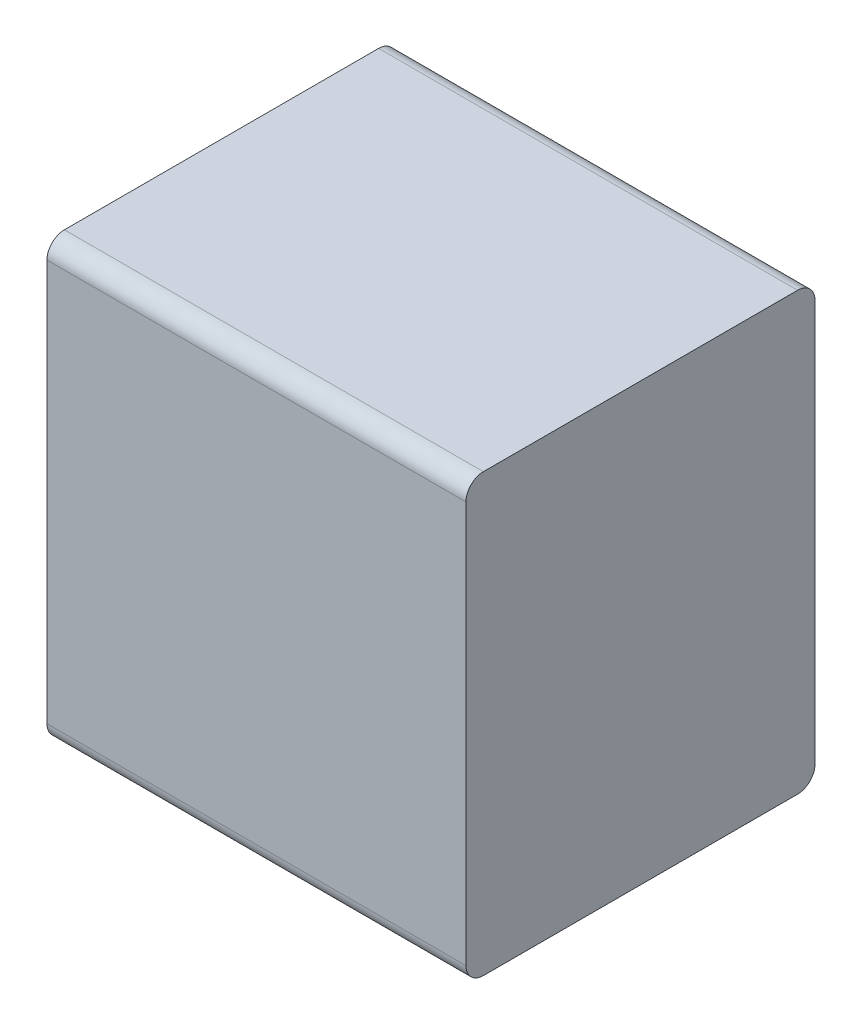
ISO-10303-21;
HEADER;
FILE_DESCRIPTION(('STEP AP214'),'2;1');
FILE_NAME('part.step','',(''),(''),'','','');
FILE_SCHEMA(('AUTOMOTIVE_DESIGN { 1 0 10303 214 1 1 1 1 }'));
ENDSEC;
DATA;
#1=APPLICATION_CONTEXT('core data for automotive mechanical design processes');
#2=APPLICATION_PROTOCOL_DEFINITION('international standard','automotive_design',2000,#1);
#3=PRODUCT_CONTEXT('',#1,'mechanical');
#4=PRODUCT('Part','Part','',(#3));
#5=PRODUCT_RELATED_PRODUCT_CATEGORY('part','',(#4));
#6=PRODUCT_DEFINITION_FORMATION('','',#4);
#7=PRODUCT_DEFINITION_CONTEXT('part definition',#1,'design');
#8=PRODUCT_DEFINITION('design','',#6,#7);
#9=PRODUCT_DEFINITION_SHAPE('','',#8);
#10=(LENGTH_UNIT() NAMED_UNIT(*) SI_UNIT(.MILLI.,.METRE.));
#11=(NAMED_UNIT(*) PLANE_ANGLE_UNIT() SI_UNIT($,.RADIAN.));
#12=(NAMED_UNIT(*) SI_UNIT($,.STERADIAN.) SOLID_ANGLE_UNIT());
#13=UNCERTAINTY_MEASURE_WITH_UNIT(LENGTH_MEASURE(1.E-05),#10,'distance_accuracy_value','');
#14=(GEOMETRIC_REPRESENTATION_CONTEXT(3) GLOBAL_UNCERTAINTY_ASSIGNED_CONTEXT((#13)) GLOBAL_UNIT_ASSIGNED_CONTEXT((#10,
#11,#12)) REPRESENTATION_CONTEXT('',''));
#15=CARTESIAN_POINT('',(0.,0.,0.));
#16=DIRECTION('',(0.,0.,1.));
#17=DIRECTION('',(1.,0.,0.));
#18=AXIS2_PLACEMENT_3D('',#15,#16,#17);
#19=CARTESIAN_POINT('',(0.,0.,0.));
#20=DIRECTION('',(0.,1.,0.));
#21=DIRECTION('',(0.,0.,1.));
#22=AXIS2_PLACEMENT_3D('',#19,#20,#21);
#23=PLANE('',#22);
#24=DIRECTION('',(1.,0.,0.));
#25=VECTOR('',#24,1.);
#26=CARTESIAN_POINT('',(0.,0.,0.95));
#27=LINE('',#26,#25);
#28=CARTESIAN_POINT('',(0.4,0.,0.95));
#29=VERTEX_POINT('',#28);
#30=CARTESIAN_POINT('',(1.6,0.,0.95));
#31=VERTEX_POINT('',#30);
#32=EDGE_CURVE('E88',#29,#31,#27,.T.);
#33=ORIENTED_EDGE('',*,*,#32,.F.);
#34=DIRECTION('',(0.,0.,-1.));
#35=VECTOR('',#34,1.);
#36=CARTESIAN_POINT('',(0.4,0.,0.));
#37=LINE('',#36,#35);
#38=CARTESIAN_POINT('',(0.4,0.,0.05));
#39=VERTEX_POINT('',#38);
#40=EDGE_CURVE('E100',#29,#39,#37,.T.);
#41=ORIENTED_EDGE('',*,*,#40,.T.);
#42=DIRECTION('',(1.,0.,0.));
#43=VECTOR('',#42,1.);
#44=CARTESIAN_POINT('',(0.,0.,0.05));
#45=LINE('',#44,#43);
#46=CARTESIAN_POINT('',(1.6,0.,0.05));
#47=VERTEX_POINT('',#46);
#48=EDGE_CURVE('E115',#47,#39,#45,.F.);
#49=ORIENTED_EDGE('',*,*,#48,.F.);
#50=DIRECTION('',(0.,0.,-1.));
#51=VECTOR('',#50,1.);
#52=CARTESIAN_POINT('',(1.6,0.,0.));
#53=LINE('',#52,#51);
#54=EDGE_CURVE('E130',#31,#47,#53,.T.);
#55=ORIENTED_EDGE('',*,*,#54,.F.);
#56=EDGE_LOOP('',(#33,#41,#49,#55));
#57=FACE_BOUND('',#56,.T.);
#58=ADVANCED_FACE('F17',(#57),#23,.F.);
#59=CARTESIAN_POINT('',(0.,1.2,0.95));
#60=DIRECTION('',(1.,0.,0.));
#61=DIRECTION('',(0.,0.,-1.));
#62=AXIS2_PLACEMENT_3D('',#59,#60,#61);
#63=CYLINDRICAL_SURFACE('',#62,0.05);
#64=DIRECTION('',(1.,0.,0.));
#65=VECTOR('',#64,1.);
#66=CARTESIAN_POINT('',(0.,1.2,1.));
#67=LINE('',#66,#65);
#68=CARTESIAN_POINT('',(1.6,1.2,1.));
#69=VERTEX_POINT('',#68);
#70=CARTESIAN_POINT('',(0.4,1.2,1.));
#71=VERTEX_POINT('',#70);
#72=EDGE_CURVE('E82',#69,#71,#67,.F.);
#73=ORIENTED_EDGE('',*,*,#72,.F.);
#74=CARTESIAN_POINT('',(1.6,1.2,0.95));
#75=DIRECTION('',(1.,0.,0.));
#76=DIRECTION('',(0.,0.,-1.));
#77=AXIS2_PLACEMENT_3D('',#74,#75,#76);
#78=CIRCLE('',#77,0.05);
#79=CARTESIAN_POINT('',(1.6,1.25,0.95));
#80=VERTEX_POINT('',#79);
#81=EDGE_CURVE('E125',#80,#69,#78,.T.);
#82=ORIENTED_EDGE('',*,*,#81,.F.);
#83=DIRECTION('',(1.,0.,0.));
#84=VECTOR('',#83,1.);
#85=CARTESIAN_POINT('',(0.,1.25,0.95));
#86=LINE('',#85,#84);
#87=CARTESIAN_POINT('',(0.4,1.25,0.95));
#88=VERTEX_POINT('',#87);
#89=EDGE_CURVE('E75',#88,#80,#86,.T.);
#90=ORIENTED_EDGE('',*,*,#89,.F.);
#91=CARTESIAN_POINT('',(0.4,1.2,0.95));
#92=DIRECTION('',(1.,0.,0.));
#93=DIRECTION('',(0.,0.,-1.));
#94=AXIS2_PLACEMENT_3D('',#91,#92,#93);
#95=CIRCLE('',#94,0.05);
#96=EDGE_CURVE('E20',#88,#71,#95,.T.);
#97=ORIENTED_EDGE('',*,*,#96,.T.);
#98=EDGE_LOOP('',(#73,#82,#90,#97));
#99=FACE_BOUND('',#98,.T.);
#100=ADVANCED_FACE('F98',(#99),#63,.T.);
#101=CARTESIAN_POINT('',(0.,0.,1.));
#102=DIRECTION('',(0.,0.,1.));
#103=DIRECTION('',(1.,0.,0.));
#104=AXIS2_PLACEMENT_3D('',#101,#102,#103);
#105=PLANE('',#104);
#106=DIRECTION('',(0.,1.,0.));
#107=VECTOR('',#106,1.);
#108=CARTESIAN_POINT('',(1.6,0.,1.));
#109=LINE('',#108,#107);
#110=CARTESIAN_POINT('',(1.6,0.05,1.));
#111=VERTEX_POINT('',#110);
#112=EDGE_CURVE('E87',#69,#111,#109,.F.);
#113=ORIENTED_EDGE('',*,*,#112,.F.);
#114=ORIENTED_EDGE('',*,*,#72,.T.);
#115=DIRECTION('',(0.,1.,0.));
#116=VECTOR('',#115,1.);
#117=CARTESIAN_POINT('',(0.4,0.,1.));
#118=LINE('',#117,#116);
#119=CARTESIAN_POINT('',(0.4,0.05,1.));
#120=VERTEX_POINT('',#119);
#121=EDGE_CURVE('E86',#71,#120,#118,.F.);
#122=ORIENTED_EDGE('',*,*,#121,.T.);
#123=DIRECTION('',(1.,0.,0.));
#124=VECTOR('',#123,1.);
#125=CARTESIAN_POINT('',(0.,0.05,1.));
#126=LINE('',#125,#124);
#127=EDGE_CURVE('E112',#111,#120,#126,.F.);
#128=ORIENTED_EDGE('',*,*,#127,.F.);
#129=EDGE_LOOP('',(#113,#114,#122,#128));
#130=FACE_BOUND('',#129,.T.);
#131=ADVANCED_FACE('F84',(#130),#105,.T.);
#132=CARTESIAN_POINT('',(0.,0.05,0.95));
#133=DIRECTION('',(1.,0.,0.));
#134=DIRECTION('',(0.,0.,-1.));
#135=AXIS2_PLACEMENT_3D('',#132,#133,#134);
#136=CYLINDRICAL_SURFACE('',#135,0.05);
#137=ORIENTED_EDGE('',*,*,#127,.T.);
#138=CARTESIAN_POINT('',(0.4,0.05,0.95));
#139=DIRECTION('',(1.,0.,0.));
#140=DIRECTION('',(0.,0.,-1.));
#141=AXIS2_PLACEMENT_3D('',#138,#139,#140);
#142=CIRCLE('',#141,0.05);
#143=EDGE_CURVE('E96',#120,#29,#142,.T.);
#144=ORIENTED_EDGE('',*,*,#143,.T.);
#145=ORIENTED_EDGE('',*,*,#32,.T.);
#146=CARTESIAN_POINT('',(1.6,0.05,0.95));
#147=DIRECTION('',(1.,0.,0.));
#148=DIRECTION('',(0.,0.,-1.));
#149=AXIS2_PLACEMENT_3D('',#146,#147,#148);
#150=CIRCLE('',#149,0.05);
#151=EDGE_CURVE('E110',#111,#31,#150,.T.);
#152=ORIENTED_EDGE('',*,*,#151,.F.);
#153=EDGE_LOOP('',(#137,#144,#145,#152));
#154=FACE_BOUND('',#153,.T.);
#155=ADVANCED_FACE('F132',(#154),#136,.T.);
#156=CARTESIAN_POINT('',(0.,1.25,0.));
#157=DIRECTION('',(0.,1.,0.));
#158=DIRECTION('',(0.,0.,1.));
#159=AXIS2_PLACEMENT_3D('',#156,#157,#158);
#160=PLANE('',#159);
#161=ORIENTED_EDGE('',*,*,#89,.T.);
#162=DIRECTION('',(0.,0.,-1.));
#163=VECTOR('',#162,1.);
#164=CARTESIAN_POINT('',(1.6,1.25,0.));
#165=LINE('',#164,#163);
#166=CARTESIAN_POINT('',(1.6,1.25,0.05));
#167=VERTEX_POINT('',#166);
#168=EDGE_CURVE('E127',#167,#80,#165,.F.);
#169=ORIENTED_EDGE('',*,*,#168,.F.);
#170=DIRECTION('',(1.,0.,0.));
#171=VECTOR('',#170,1.);
#172=CARTESIAN_POINT('',(0.,1.25,0.05));
#173=LINE('',#172,#171);
#174=CARTESIAN_POINT('',(0.4,1.25,0.05));
#175=VERTEX_POINT('',#174);
#176=EDGE_CURVE('E108',#175,#167,#173,.T.);
#177=ORIENTED_EDGE('',*,*,#176,.F.);
#178=DIRECTION('',(0.,0.,-1.));
#179=VECTOR('',#178,1.);
#180=CARTESIAN_POINT('',(0.4,1.25,0.));
#181=LINE('',#180,#179);
#182=EDGE_CURVE('E99',#175,#88,#181,.F.);
#183=ORIENTED_EDGE('',*,*,#182,.T.);
#184=EDGE_LOOP('',(#161,#169,#177,#183));
#185=FACE_BOUND('',#184,.T.);
#186=ADVANCED_FACE('F160',(#185),#160,.T.);
#187=CARTESIAN_POINT('',(0.4,0.,0.));
#188=DIRECTION('',(1.,0.,0.));
#189=DIRECTION('',(0.,0.,-1.));
#190=AXIS2_PLACEMENT_3D('',#187,#188,#189);
#191=PLANE('',#190);
#192=ORIENTED_EDGE('',*,*,#121,.F.);
#193=ORIENTED_EDGE('',*,*,#96,.F.);
#194=ORIENTED_EDGE('',*,*,#182,.F.);
#195=CARTESIAN_POINT('',(0.4,1.2,0.05));
#196=DIRECTION('',(1.,0.,0.));
#197=DIRECTION('',(0.,0.,-1.));
#198=AXIS2_PLACEMENT_3D('',#195,#196,#197);
#199=CIRCLE('',#198,0.05);
#200=CARTESIAN_POINT('',(0.4,1.2,0.));
#201=VERTEX_POINT('',#200);
#202=EDGE_CURVE('E118',#201,#175,#199,.T.);
#203=ORIENTED_EDGE('',*,*,#202,.F.);
#204=DIRECTION('',(0.,1.,0.));
#205=VECTOR('',#204,1.);
#206=CARTESIAN_POINT('',(0.4,0.,0.));
#207=LINE('',#206,#205);
#208=CARTESIAN_POINT('',(0.4,0.05,0.));
#209=VERTEX_POINT('',#208);
#210=EDGE_CURVE('E121',#201,#209,#207,.F.);
#211=ORIENTED_EDGE('',*,*,#210,.T.);
#212=CARTESIAN_POINT('',(0.4,0.05,0.05));
#213=DIRECTION('',(1.,0.,0.));
#214=DIRECTION('',(0.,0.,-1.));
#215=AXIS2_PLACEMENT_3D('',#212,#213,#214);
#216=CIRCLE('',#215,0.05);
#217=EDGE_CURVE('E117',#39,#209,#216,.T.);
#218=ORIENTED_EDGE('',*,*,#217,.F.);
#219=ORIENTED_EDGE('',*,*,#40,.F.);
#220=ORIENTED_EDGE('',*,*,#143,.F.);
#221=EDGE_LOOP('',(#192,#193,#194,#203,#211,#218,#219,#220));
#222=FACE_BOUND('',#221,.T.);
#223=ADVANCED_FACE('F92',(#222),#191,.F.);
#224=CARTESIAN_POINT('',(0.,0.05,0.05));
#225=DIRECTION('',(1.,0.,0.));
#226=DIRECTION('',(0.,0.,-1.));
#227=AXIS2_PLACEMENT_3D('',#224,#225,#226);
#228=CYLINDRICAL_SURFACE('',#227,0.05);
#229=DIRECTION('',(1.,0.,0.));
#230=VECTOR('',#229,1.);
#231=CARTESIAN_POINT('',(0.,0.05,0.));
#232=LINE('',#231,#230);
#233=CARTESIAN_POINT('',(1.6,0.05,0.));
#234=VERTEX_POINT('',#233);
#235=EDGE_CURVE('E145',#209,#234,#232,.T.);
#236=ORIENTED_EDGE('',*,*,#235,.T.);
#237=CARTESIAN_POINT('',(1.6,0.05,0.05));
#238=DIRECTION('',(1.,0.,0.));
#239=DIRECTION('',(0.,0.,-1.));
#240=AXIS2_PLACEMENT_3D('',#237,#238,#239);
#241=CIRCLE('',#240,0.05);
#242=EDGE_CURVE('E128',#47,#234,#241,.T.);
#243=ORIENTED_EDGE('',*,*,#242,.F.);
#244=ORIENTED_EDGE('',*,*,#48,.T.);
#245=ORIENTED_EDGE('',*,*,#217,.T.);
#246=EDGE_LOOP('',(#236,#243,#244,#245));
#247=FACE_BOUND('',#246,.T.);
#248=ADVANCED_FACE('F163',(#247),#228,.T.);
#249=CARTESIAN_POINT('',(1.6,0.,0.));
#250=DIRECTION('',(1.,0.,0.));
#251=DIRECTION('',(0.,0.,-1.));
#252=AXIS2_PLACEMENT_3D('',#249,#250,#251);
#253=PLANE('',#252);
#254=ORIENTED_EDGE('',*,*,#112,.T.);
#255=ORIENTED_EDGE('',*,*,#151,.T.);
#256=ORIENTED_EDGE('',*,*,#54,.T.);
#257=ORIENTED_EDGE('',*,*,#242,.T.);
#258=DIRECTION('',(0.,1.,0.));
#259=VECTOR('',#258,1.);
#260=CARTESIAN_POINT('',(1.6,0.,0.));
#261=LINE('',#260,#259);
#262=CARTESIAN_POINT('',(1.6,1.2,0.));
#263=VERTEX_POINT('',#262);
#264=EDGE_CURVE('E26',#234,#263,#261,.T.);
#265=ORIENTED_EDGE('',*,*,#264,.T.);
#266=CARTESIAN_POINT('',(1.6,1.2,0.05));
#267=DIRECTION('',(1.,0.,0.));
#268=DIRECTION('',(0.,0.,-1.));
#269=AXIS2_PLACEMENT_3D('',#266,#267,#268);
#270=CIRCLE('',#269,0.05);
#271=EDGE_CURVE('E34',#167,#263,#270,.F.);
#272=ORIENTED_EDGE('',*,*,#271,.F.);
#273=ORIENTED_EDGE('',*,*,#168,.T.);
#274=ORIENTED_EDGE('',*,*,#81,.T.);
#275=EDGE_LOOP('',(#254,#255,#256,#257,#265,#272,#273,#274));
#276=FACE_BOUND('',#275,.T.);
#277=ADVANCED_FACE('F137',(#276),#253,.T.);
#278=CARTESIAN_POINT('',(0.,1.2,0.05));
#279=DIRECTION('',(1.,0.,0.));
#280=DIRECTION('',(0.,0.,-1.));
#281=AXIS2_PLACEMENT_3D('',#278,#279,#280);
#282=CYLINDRICAL_SURFACE('',#281,0.05);
#283=DIRECTION('',(1.,0.,0.));
#284=VECTOR('',#283,1.);
#285=CARTESIAN_POINT('',(0.,1.2,0.));
#286=LINE('',#285,#284);
#287=EDGE_CURVE('E11',#263,#201,#286,.F.);
#288=ORIENTED_EDGE('',*,*,#287,.T.);
#289=ORIENTED_EDGE('',*,*,#202,.T.);
#290=ORIENTED_EDGE('',*,*,#176,.T.);
#291=ORIENTED_EDGE('',*,*,#271,.T.);
#292=EDGE_LOOP('',(#288,#289,#290,#291));
#293=FACE_BOUND('',#292,.T.);
#294=ADVANCED_FACE('F158',(#293),#282,.T.);
#295=CARTESIAN_POINT('',(0.,0.,0.));
#296=DIRECTION('',(0.,0.,1.));
#297=DIRECTION('',(1.,0.,0.));
#298=AXIS2_PLACEMENT_3D('',#295,#296,#297);
#299=PLANE('',#298);
#300=ORIENTED_EDGE('',*,*,#264,.F.);
#301=ORIENTED_EDGE('',*,*,#235,.F.);
#302=ORIENTED_EDGE('',*,*,#210,.F.);
#303=ORIENTED_EDGE('',*,*,#287,.F.);
#304=EDGE_LOOP('',(#300,#301,#302,#303));
#305=FACE_BOUND('',#304,.T.);
#306=ADVANCED_FACE('F156',(#305),#299,.F.);
#307=CLOSED_SHELL('',(#58,#100,#131,#155,#186,#223,#248,#277,#294,#306));
#308=MANIFOLD_SOLID_BREP('B1',#307);
#309=ADVANCED_BREP_SHAPE_REPRESENTATION('',(#18,#308),#14);
#310=SHAPE_DEFINITION_REPRESENTATION(#9,#309);
ENDSEC;
END-ISO-10303-21;
